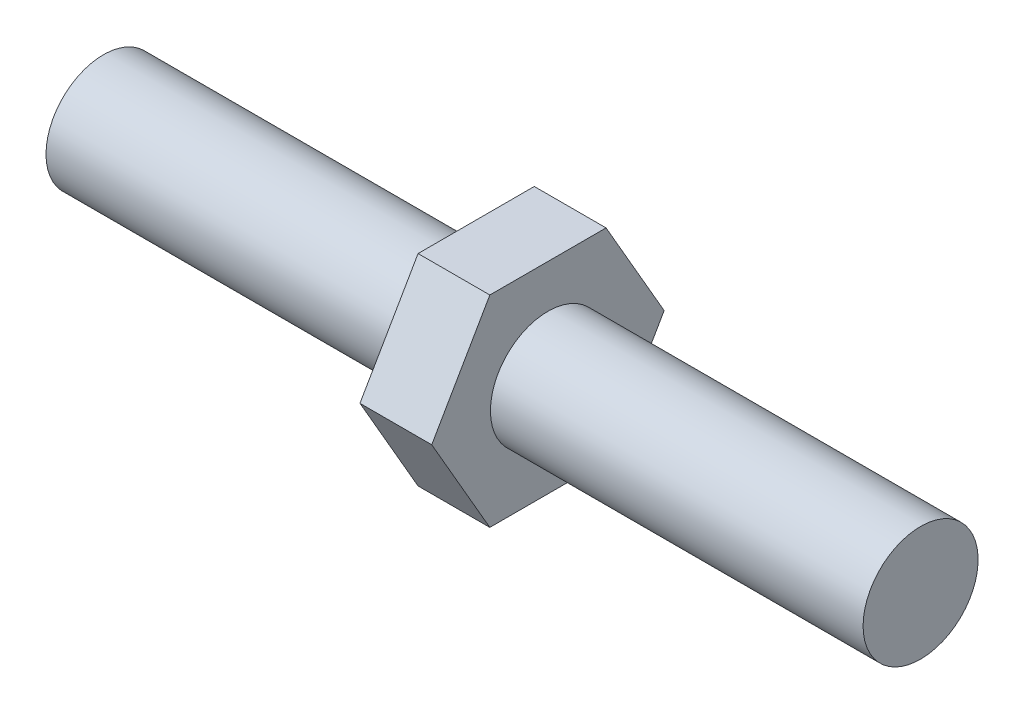
ISO-10303-21;
HEADER;
FILE_DESCRIPTION(('STEP AP214'),'2;1');
FILE_NAME('part.step','',(''),(''),'','','');
FILE_SCHEMA(('AUTOMOTIVE_DESIGN { 1 0 10303 214 1 1 1 1 }'));
ENDSEC;
DATA;
#1=APPLICATION_CONTEXT('core data for automotive mechanical design processes');
#2=APPLICATION_PROTOCOL_DEFINITION('international standard','automotive_design',2000,#1);
#3=PRODUCT_CONTEXT('',#1,'mechanical');
#4=PRODUCT('Part','Part','',(#3));
#5=PRODUCT_RELATED_PRODUCT_CATEGORY('part','',(#4));
#6=PRODUCT_DEFINITION_FORMATION('','',#4);
#7=PRODUCT_DEFINITION_CONTEXT('part definition',#1,'design');
#8=PRODUCT_DEFINITION('design','',#6,#7);
#9=PRODUCT_DEFINITION_SHAPE('','',#8);
#10=(LENGTH_UNIT() NAMED_UNIT(*) SI_UNIT(.MILLI.,.METRE.));
#11=(NAMED_UNIT(*) PLANE_ANGLE_UNIT() SI_UNIT($,.RADIAN.));
#12=(NAMED_UNIT(*) SI_UNIT($,.STERADIAN.) SOLID_ANGLE_UNIT());
#13=UNCERTAINTY_MEASURE_WITH_UNIT(LENGTH_MEASURE(1.E-05),#10,'distance_accuracy_value','');
#14=(GEOMETRIC_REPRESENTATION_CONTEXT(3) GLOBAL_UNCERTAINTY_ASSIGNED_CONTEXT((#13)) GLOBAL_UNIT_ASSIGNED_CONTEXT((#10,
#11,#12)) REPRESENTATION_CONTEXT('',''));
#15=CARTESIAN_POINT('',(0.,0.,0.));
#16=DIRECTION('',(0.,0.,1.));
#17=DIRECTION('',(1.,0.,0.));
#18=AXIS2_PLACEMENT_3D('',#15,#16,#17);
#19=CARTESIAN_POINT('',(1.9812,5.55625,0.));
#20=DIRECTION('',(-1.,0.,0.));
#21=DIRECTION('',(0.,0.,1.));
#22=AXIS2_PLACEMENT_3D('',#19,#20,#21);
#23=PLANE('',#22);
#24=DIRECTION('',(0.,-0.866025403784439,-0.5));
#25=VECTOR('',#24,1.);
#26=CARTESIAN_POINT('',(1.9812,0.,-6.41580486636972));
#27=LINE('',#26,#25);
#28=CARTESIAN_POINT('',(1.9812,5.55625,-3.20790243318486));
#29=VERTEX_POINT('',#28);
#30=CARTESIAN_POINT('',(1.9812,0.,-6.41580486636972));
#31=VERTEX_POINT('',#30);
#32=EDGE_CURVE('E57',#29,#31,#27,.T.);
#33=ORIENTED_EDGE('',*,*,#32,.F.);
#34=DIRECTION('',(0.,0.,-1.));
#35=VECTOR('',#34,1.);
#36=CARTESIAN_POINT('',(1.9812,5.55625,-3.20790243318486));
#37=LINE('',#36,#35);
#38=CARTESIAN_POINT('',(1.9812,5.55625,3.20790243318486));
#39=VERTEX_POINT('',#38);
#40=EDGE_CURVE('E65',#39,#29,#37,.T.);
#41=ORIENTED_EDGE('',*,*,#40,.F.);
#42=DIRECTION('',(0.,0.866025403784439,-0.5));
#43=VECTOR('',#42,1.);
#44=CARTESIAN_POINT('',(1.9812,5.55625,3.20790243318486));
#45=LINE('',#44,#43);
#46=CARTESIAN_POINT('',(1.9812,0.,6.41580486636972));
#47=VERTEX_POINT('',#46);
#48=EDGE_CURVE('E126',#47,#39,#45,.T.);
#49=ORIENTED_EDGE('',*,*,#48,.F.);
#50=DIRECTION('',(0.,0.866025403784439,0.5));
#51=VECTOR('',#50,1.);
#52=CARTESIAN_POINT('',(1.9812,0.,6.41580486636972));
#53=LINE('',#52,#51);
#54=CARTESIAN_POINT('',(1.9812,-5.55625,3.20790243318486));
#55=VERTEX_POINT('',#54);
#56=EDGE_CURVE('E119',#55,#47,#53,.T.);
#57=ORIENTED_EDGE('',*,*,#56,.F.);
#58=DIRECTION('',(0.,0.,1.));
#59=VECTOR('',#58,1.);
#60=CARTESIAN_POINT('',(1.9812,-5.55625,3.20790243318486));
#61=LINE('',#60,#59);
#62=CARTESIAN_POINT('',(1.9812,-5.55625,-3.20790243318486));
#63=VERTEX_POINT('',#62);
#64=EDGE_CURVE('E131',#63,#55,#61,.T.);
#65=ORIENTED_EDGE('',*,*,#64,.F.);
#66=DIRECTION('',(0.,-0.866025403784439,0.5));
#67=VECTOR('',#66,1.);
#68=CARTESIAN_POINT('',(1.9812,-5.55625,-3.20790243318486));
#69=LINE('',#68,#67);
#70=EDGE_CURVE('E162',#31,#63,#69,.T.);
#71=ORIENTED_EDGE('',*,*,#70,.F.);
#72=EDGE_LOOP('',(#33,#41,#49,#57,#65,#71));
#73=FACE_BOUND('',#72,.T.);
#74=CARTESIAN_POINT('',(1.9812,0.,0.));
#75=DIRECTION('',(-1.,0.,0.));
#76=DIRECTION('',(0.,0.,1.));
#77=AXIS2_PLACEMENT_3D('',#74,#75,#76);
#78=CIRCLE('',#77,3.175);
#79=CARTESIAN_POINT('',(1.9812,0.,3.175));
#80=VERTEX_POINT('',#79);
#81=EDGE_CURVE('E11',#80,#80,#78,.T.);
#82=ORIENTED_EDGE('',*,*,#81,.T.);
#83=EDGE_LOOP('',(#82));
#84=FACE_BOUND('',#83,.T.);
#85=ADVANCED_FACE('F42',(#73,#84),#23,.F.);
#86=CARTESIAN_POINT('',(-22.5552,0.,0.));
#87=DIRECTION('',(-1.,0.,0.));
#88=DIRECTION('',(0.,0.,1.));
#89=AXIS2_PLACEMENT_3D('',#86,#87,#88);
#90=CYLINDRICAL_SURFACE('',#89,3.175);
#91=ORIENTED_EDGE('',*,*,#81,.F.);
#92=EDGE_LOOP('',(#91));
#93=FACE_BOUND('',#92,.T.);
#94=CARTESIAN_POINT('',(22.5552,0.,0.));
#95=DIRECTION('',(-1.,0.,0.));
#96=DIRECTION('',(0.,0.,1.));
#97=AXIS2_PLACEMENT_3D('',#94,#95,#96);
#98=CIRCLE('',#97,3.17500000000001);
#99=CARTESIAN_POINT('',(22.5552,0.,3.17500000000001));
#100=VERTEX_POINT('',#99);
#101=EDGE_CURVE('E50',#100,#100,#98,.T.);
#102=ORIENTED_EDGE('',*,*,#101,.T.);
#103=EDGE_LOOP('',(#102));
#104=FACE_BOUND('',#103,.T.);
#105=ADVANCED_FACE('F136',(#93,#104),#90,.T.);
#106=CARTESIAN_POINT('',(22.5552,3.17500000000001,0.));
#107=DIRECTION('',(-1.,0.,0.));
#108=DIRECTION('',(0.,0.,1.));
#109=AXIS2_PLACEMENT_3D('',#106,#107,#108);
#110=PLANE('',#109);
#111=ORIENTED_EDGE('',*,*,#101,.F.);
#112=EDGE_LOOP('',(#111));
#113=FACE_BOUND('',#112,.T.);
#114=ADVANCED_FACE('F138',(#113),#110,.F.);
#115=CARTESIAN_POINT('',(18.9558241367323,0.,6.41580486636972));
#116=DIRECTION('',(0.,0.5,-0.866025403784439));
#117=DIRECTION('',(0.,0.866025403784439,0.5));
#118=AXIS2_PLACEMENT_3D('',#115,#116,#117);
#119=PLANE('',#118);
#120=ORIENTED_EDGE('',*,*,#56,.T.);
#121=DIRECTION('',(-1.,0.,0.));
#122=VECTOR('',#121,1.);
#123=CARTESIAN_POINT('',(18.9558241367323,0.,6.41580486636972));
#124=LINE('',#123,#122);
#125=CARTESIAN_POINT('',(-1.9812,0.,6.41580486636972));
#126=VERTEX_POINT('',#125);
#127=EDGE_CURVE('E173',#47,#126,#124,.T.);
#128=ORIENTED_EDGE('',*,*,#127,.T.);
#129=DIRECTION('',(0.,0.866025403784439,0.5));
#130=VECTOR('',#129,1.);
#131=CARTESIAN_POINT('',(-1.9812,0.,6.41580486636972));
#132=LINE('',#131,#130);
#133=CARTESIAN_POINT('',(-1.9812,-5.55625,3.20790243318486));
#134=VERTEX_POINT('',#133);
#135=EDGE_CURVE('E168',#134,#126,#132,.T.);
#136=ORIENTED_EDGE('',*,*,#135,.F.);
#137=DIRECTION('',(-1.,0.,0.));
#138=VECTOR('',#137,1.);
#139=CARTESIAN_POINT('',(18.9558241367323,-5.55625,3.20790243318486));
#140=LINE('',#139,#138);
#141=EDGE_CURVE('E107',#55,#134,#140,.T.);
#142=ORIENTED_EDGE('',*,*,#141,.F.);
#143=EDGE_LOOP('',(#120,#128,#136,#142));
#144=FACE_BOUND('',#143,.T.);
#145=ADVANCED_FACE('F140',(#144),#119,.F.);
#146=CARTESIAN_POINT('',(18.9558241367323,5.55625,3.20790243318486));
#147=DIRECTION('',(0.,-0.5,-0.866025403784439));
#148=DIRECTION('',(0.,0.866025403784439,-0.5));
#149=AXIS2_PLACEMENT_3D('',#146,#147,#148);
#150=PLANE('',#149);
#151=ORIENTED_EDGE('',*,*,#48,.T.);
#152=DIRECTION('',(-1.,0.,0.));
#153=VECTOR('',#152,1.);
#154=CARTESIAN_POINT('',(18.9558241367323,5.55625,3.20790243318486));
#155=LINE('',#154,#153);
#156=CARTESIAN_POINT('',(-1.9812,5.55625,3.20790243318486));
#157=VERTEX_POINT('',#156);
#158=EDGE_CURVE('E121',#39,#157,#155,.T.);
#159=ORIENTED_EDGE('',*,*,#158,.T.);
#160=DIRECTION('',(0.,0.866025403784439,-0.5));
#161=VECTOR('',#160,1.);
#162=CARTESIAN_POINT('',(-1.9812,5.55625,3.20790243318486));
#163=LINE('',#162,#161);
#164=EDGE_CURVE('E166',#126,#157,#163,.T.);
#165=ORIENTED_EDGE('',*,*,#164,.F.);
#166=ORIENTED_EDGE('',*,*,#127,.F.);
#167=EDGE_LOOP('',(#151,#159,#165,#166));
#168=FACE_BOUND('',#167,.T.);
#169=ADVANCED_FACE('F147',(#168),#150,.F.);
#170=CARTESIAN_POINT('',(18.9558241367323,5.55625,-3.20790243318486));
#171=DIRECTION('',(0.,-1.,0.));
#172=DIRECTION('',(0.,0.,-1.));
#173=AXIS2_PLACEMENT_3D('',#170,#171,#172);
#174=PLANE('',#173);
#175=ORIENTED_EDGE('',*,*,#40,.T.);
#176=DIRECTION('',(-1.,0.,0.));
#177=VECTOR('',#176,1.);
#178=CARTESIAN_POINT('',(18.9558241367323,5.55625,-3.20790243318486));
#179=LINE('',#178,#177);
#180=CARTESIAN_POINT('',(-1.9812,5.55625,-3.20790243318486));
#181=VERTEX_POINT('',#180);
#182=EDGE_CURVE('E117',#29,#181,#179,.T.);
#183=ORIENTED_EDGE('',*,*,#182,.T.);
#184=DIRECTION('',(0.,0.,-1.));
#185=VECTOR('',#184,1.);
#186=CARTESIAN_POINT('',(-1.9812,5.55625,-3.20790243318486));
#187=LINE('',#186,#185);
#188=EDGE_CURVE('E114',#157,#181,#187,.T.);
#189=ORIENTED_EDGE('',*,*,#188,.F.);
#190=ORIENTED_EDGE('',*,*,#158,.F.);
#191=EDGE_LOOP('',(#175,#183,#189,#190));
#192=FACE_BOUND('',#191,.T.);
#193=ADVANCED_FACE('F164',(#192),#174,.F.);
#194=CARTESIAN_POINT('',(18.9558241367323,0.,-6.41580486636972));
#195=DIRECTION('',(0.,-0.5,0.866025403784439));
#196=DIRECTION('',(0.,-0.866025403784439,-0.5));
#197=AXIS2_PLACEMENT_3D('',#194,#195,#196);
#198=PLANE('',#197);
#199=ORIENTED_EDGE('',*,*,#32,.T.);
#200=DIRECTION('',(-1.,0.,0.));
#201=VECTOR('',#200,1.);
#202=CARTESIAN_POINT('',(18.9558241367323,0.,-6.41580486636972));
#203=LINE('',#202,#201);
#204=CARTESIAN_POINT('',(-1.9812,0.,-6.41580486636972));
#205=VERTEX_POINT('',#204);
#206=EDGE_CURVE('E102',#31,#205,#203,.T.);
#207=ORIENTED_EDGE('',*,*,#206,.T.);
#208=DIRECTION('',(0.,-0.866025403784439,-0.5));
#209=VECTOR('',#208,1.);
#210=CARTESIAN_POINT('',(-1.9812,0.,-6.41580486636972));
#211=LINE('',#210,#209);
#212=EDGE_CURVE('E111',#181,#205,#211,.T.);
#213=ORIENTED_EDGE('',*,*,#212,.F.);
#214=ORIENTED_EDGE('',*,*,#182,.F.);
#215=EDGE_LOOP('',(#199,#207,#213,#214));
#216=FACE_BOUND('',#215,.T.);
#217=ADVANCED_FACE('F116',(#216),#198,.F.);
#218=CARTESIAN_POINT('',(18.9558241367323,-5.55625,-3.20790243318486));
#219=DIRECTION('',(0.,0.5,0.866025403784439));
#220=DIRECTION('',(0.,-0.866025403784439,0.5));
#221=AXIS2_PLACEMENT_3D('',#218,#219,#220);
#222=PLANE('',#221);
#223=ORIENTED_EDGE('',*,*,#70,.T.);
#224=DIRECTION('',(-1.,0.,0.));
#225=VECTOR('',#224,1.);
#226=CARTESIAN_POINT('',(18.9558241367323,-5.55625,-3.20790243318486));
#227=LINE('',#226,#225);
#228=CARTESIAN_POINT('',(-1.9812,-5.55625,-3.20790243318486));
#229=VERTEX_POINT('',#228);
#230=EDGE_CURVE('E104',#63,#229,#227,.T.);
#231=ORIENTED_EDGE('',*,*,#230,.T.);
#232=DIRECTION('',(0.,-0.866025403784439,0.5));
#233=VECTOR('',#232,1.);
#234=CARTESIAN_POINT('',(-1.9812,-5.55625,-3.20790243318486));
#235=LINE('',#234,#233);
#236=EDGE_CURVE('E99',#205,#229,#235,.T.);
#237=ORIENTED_EDGE('',*,*,#236,.F.);
#238=ORIENTED_EDGE('',*,*,#206,.F.);
#239=EDGE_LOOP('',(#223,#231,#237,#238));
#240=FACE_BOUND('',#239,.T.);
#241=ADVANCED_FACE('F101',(#240),#222,.F.);
#242=CARTESIAN_POINT('',(18.9558241367323,-5.55625,3.20790243318486));
#243=DIRECTION('',(0.,1.,0.));
#244=DIRECTION('',(0.,0.,1.));
#245=AXIS2_PLACEMENT_3D('',#242,#243,#244);
#246=PLANE('',#245);
#247=ORIENTED_EDGE('',*,*,#64,.T.);
#248=ORIENTED_EDGE('',*,*,#141,.T.);
#249=DIRECTION('',(0.,0.,1.));
#250=VECTOR('',#249,1.);
#251=CARTESIAN_POINT('',(-1.9812,-5.55625,3.20790243318486));
#252=LINE('',#251,#250);
#253=EDGE_CURVE('E108',#229,#134,#252,.T.);
#254=ORIENTED_EDGE('',*,*,#253,.F.);
#255=ORIENTED_EDGE('',*,*,#230,.F.);
#256=EDGE_LOOP('',(#247,#248,#254,#255));
#257=FACE_BOUND('',#256,.T.);
#258=ADVANCED_FACE('F185',(#257),#246,.F.);
#259=CARTESIAN_POINT('',(-22.5552,0.,0.));
#260=DIRECTION('',(1.,0.,0.));
#261=DIRECTION('',(0.,0.,-1.));
#262=AXIS2_PLACEMENT_3D('',#259,#260,#261);
#263=PLANE('',#262);
#264=CARTESIAN_POINT('',(-22.5552,0.,0.));
#265=DIRECTION('',(-1.,0.,0.));
#266=DIRECTION('',(0.,0.,1.));
#267=AXIS2_PLACEMENT_3D('',#264,#265,#266);
#268=CIRCLE('',#267,3.175);
#269=CARTESIAN_POINT('',(-22.5552,0.,3.175));
#270=VERTEX_POINT('',#269);
#271=EDGE_CURVE('E130',#270,#270,#268,.T.);
#272=ORIENTED_EDGE('',*,*,#271,.T.);
#273=EDGE_LOOP('',(#272));
#274=FACE_BOUND('',#273,.T.);
#275=ADVANCED_FACE('F188',(#274),#263,.F.);
#276=CARTESIAN_POINT('',(-22.5552,0.,0.));
#277=DIRECTION('',(-1.,0.,0.));
#278=DIRECTION('',(0.,0.,1.));
#279=AXIS2_PLACEMENT_3D('',#276,#277,#278);
#280=CYLINDRICAL_SURFACE('',#279,3.175);
#281=ORIENTED_EDGE('',*,*,#271,.F.);
#282=EDGE_LOOP('',(#281));
#283=FACE_BOUND('',#282,.T.);
#284=CARTESIAN_POINT('',(-1.9812,0.,0.));
#285=DIRECTION('',(-1.,0.,0.));
#286=DIRECTION('',(0.,0.,1.));
#287=AXIS2_PLACEMENT_3D('',#284,#285,#286);
#288=CIRCLE('',#287,3.175);
#289=CARTESIAN_POINT('',(-1.9812,0.,3.175));
#290=VERTEX_POINT('',#289);
#291=EDGE_CURVE('E127',#290,#290,#288,.T.);
#292=ORIENTED_EDGE('',*,*,#291,.T.);
#293=EDGE_LOOP('',(#292));
#294=FACE_BOUND('',#293,.T.);
#295=ADVANCED_FACE('F194',(#283,#294),#280,.T.);
#296=CARTESIAN_POINT('',(-1.9812,3.175,0.));
#297=DIRECTION('',(1.,0.,0.));
#298=DIRECTION('',(0.,0.,-1.));
#299=AXIS2_PLACEMENT_3D('',#296,#297,#298);
#300=PLANE('',#299);
#301=ORIENTED_EDGE('',*,*,#291,.F.);
#302=EDGE_LOOP('',(#301));
#303=FACE_BOUND('',#302,.T.);
#304=ORIENTED_EDGE('',*,*,#135,.T.);
#305=ORIENTED_EDGE('',*,*,#164,.T.);
#306=ORIENTED_EDGE('',*,*,#188,.T.);
#307=ORIENTED_EDGE('',*,*,#212,.T.);
#308=ORIENTED_EDGE('',*,*,#236,.T.);
#309=ORIENTED_EDGE('',*,*,#253,.T.);
#310=EDGE_LOOP('',(#304,#305,#306,#307,#308,#309));
#311=FACE_BOUND('',#310,.T.);
#312=ADVANCED_FACE('F44',(#303,#311),#300,.F.);
#313=CLOSED_SHELL('',(#85,#105,#114,#145,#169,#193,#217,#241,#258,#275,#295,#312));
#314=MANIFOLD_SOLID_BREP('B2',#313);
#315=ADVANCED_BREP_SHAPE_REPRESENTATION('',(#18,#314),#14);
#316=SHAPE_DEFINITION_REPRESENTATION(#9,#315);
ENDSEC;
END-ISO-10303-21;
